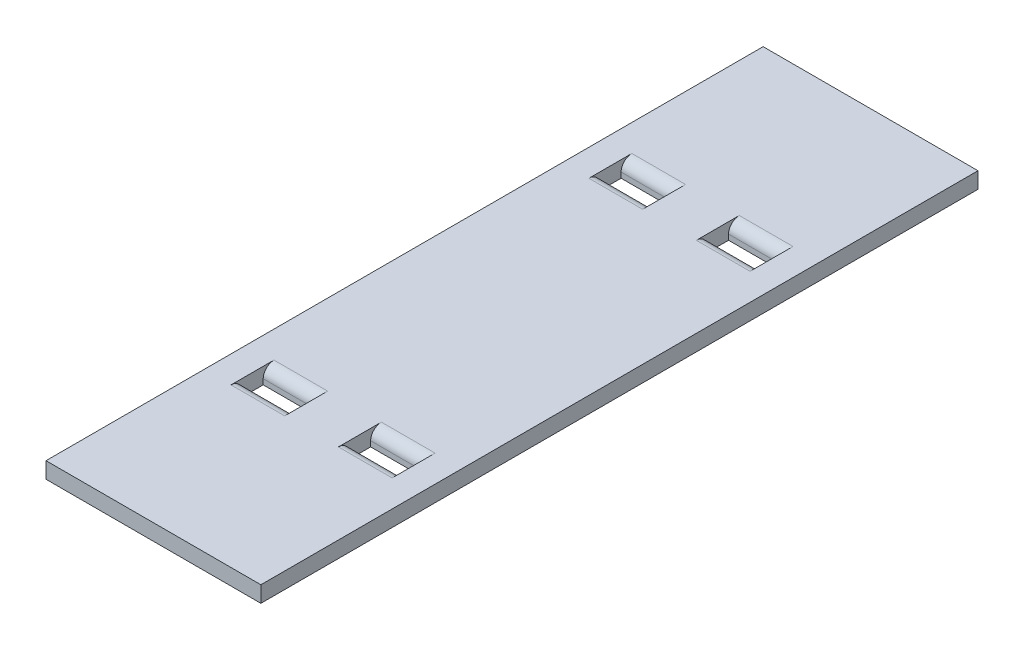
ISO-10303-21;
HEADER;
FILE_DESCRIPTION(('STEP AP214'),'2;1');
FILE_NAME('part.step','',(''),(''),'','','');
FILE_SCHEMA(('AUTOMOTIVE_DESIGN { 1 0 10303 214 1 1 1 1 }'));
ENDSEC;
DATA;
#1=APPLICATION_CONTEXT('core data for automotive mechanical design processes');
#2=APPLICATION_PROTOCOL_DEFINITION('international standard','automotive_design',2000,#1);
#3=PRODUCT_CONTEXT('',#1,'mechanical');
#4=PRODUCT('Part','Part','',(#3));
#5=PRODUCT_RELATED_PRODUCT_CATEGORY('part','',(#4));
#6=PRODUCT_DEFINITION_FORMATION('','',#4);
#7=PRODUCT_DEFINITION_CONTEXT('part definition',#1,'design');
#8=PRODUCT_DEFINITION('design','',#6,#7);
#9=PRODUCT_DEFINITION_SHAPE('','',#8);
#10=(LENGTH_UNIT() NAMED_UNIT(*) SI_UNIT(.MILLI.,.METRE.));
#11=(NAMED_UNIT(*) PLANE_ANGLE_UNIT() SI_UNIT($,.RADIAN.));
#12=(NAMED_UNIT(*) SI_UNIT($,.STERADIAN.) SOLID_ANGLE_UNIT());
#13=UNCERTAINTY_MEASURE_WITH_UNIT(LENGTH_MEASURE(1.E-05),#10,'distance_accuracy_value','');
#14=(GEOMETRIC_REPRESENTATION_CONTEXT(3) GLOBAL_UNCERTAINTY_ASSIGNED_CONTEXT((#13)) GLOBAL_UNIT_ASSIGNED_CONTEXT((#10,
#11,#12)) REPRESENTATION_CONTEXT('',''));
#15=CARTESIAN_POINT('',(0.,0.,0.));
#16=DIRECTION('',(0.,0.,1.));
#17=DIRECTION('',(1.,0.,0.));
#18=AXIS2_PLACEMENT_3D('',#15,#16,#17);
#19=CARTESIAN_POINT('',(20.,3.,-66.75));
#20=DIRECTION('',(-1.,0.,0.));
#21=DIRECTION('',(0.,0.,1.));
#22=AXIS2_PLACEMENT_3D('',#19,#20,#21);
#23=PLANE('',#22);
#24=DIRECTION('',(0.,0.,-1.));
#25=VECTOR('',#24,1.);
#26=CARTESIAN_POINT('',(20.,0.,-66.75));
#27=LINE('',#26,#25);
#28=CARTESIAN_POINT('',(20.,0.,66.75));
#29=VERTEX_POINT('',#28);
#30=CARTESIAN_POINT('',(20.,0.,-66.75));
#31=VERTEX_POINT('',#30);
#32=EDGE_CURVE('E376',#29,#31,#27,.T.);
#33=ORIENTED_EDGE('',*,*,#32,.T.);
#34=DIRECTION('',(0.,-1.,0.));
#35=VECTOR('',#34,1.);
#36=CARTESIAN_POINT('',(20.,3.,-66.75));
#37=LINE('',#36,#35);
#38=CARTESIAN_POINT('',(20.,3.,-66.75));
#39=VERTEX_POINT('',#38);
#40=EDGE_CURVE('E414',#39,#31,#37,.T.);
#41=ORIENTED_EDGE('',*,*,#40,.F.);
#42=DIRECTION('',(0.,0.,-1.));
#43=VECTOR('',#42,1.);
#44=CARTESIAN_POINT('',(20.,3.,-66.75));
#45=LINE('',#44,#43);
#46=CARTESIAN_POINT('',(20.,3.,66.75));
#47=VERTEX_POINT('',#46);
#48=EDGE_CURVE('E377',#47,#39,#45,.T.);
#49=ORIENTED_EDGE('',*,*,#48,.F.);
#50=DIRECTION('',(0.,-1.,0.));
#51=VECTOR('',#50,1.);
#52=CARTESIAN_POINT('',(20.,3.,66.75));
#53=LINE('',#52,#51);
#54=EDGE_CURVE('E391',#47,#29,#53,.T.);
#55=ORIENTED_EDGE('',*,*,#54,.T.);
#56=EDGE_LOOP('',(#33,#41,#49,#55));
#57=FACE_BOUND('',#56,.T.);
#58=ADVANCED_FACE('F45',(#57),#23,.F.);
#59=CARTESIAN_POINT('',(-20.,3.,-66.75));
#60=DIRECTION('',(0.,0.,1.));
#61=DIRECTION('',(1.,0.,0.));
#62=AXIS2_PLACEMENT_3D('',#59,#60,#61);
#63=PLANE('',#62);
#64=DIRECTION('',(-1.,0.,0.));
#65=VECTOR('',#64,1.);
#66=CARTESIAN_POINT('',(-20.,0.,-66.75));
#67=LINE('',#66,#65);
#68=CARTESIAN_POINT('',(-20.,0.,-66.75));
#69=VERTEX_POINT('',#68);
#70=EDGE_CURVE('E395',#31,#69,#67,.T.);
#71=ORIENTED_EDGE('',*,*,#70,.T.);
#72=DIRECTION('',(0.,-1.,0.));
#73=VECTOR('',#72,1.);
#74=CARTESIAN_POINT('',(-20.,3.,-66.75));
#75=LINE('',#74,#73);
#76=CARTESIAN_POINT('',(-20.,3.,-66.75));
#77=VERTEX_POINT('',#76);
#78=EDGE_CURVE('E410',#77,#69,#75,.T.);
#79=ORIENTED_EDGE('',*,*,#78,.F.);
#80=DIRECTION('',(-1.,0.,0.));
#81=VECTOR('',#80,1.);
#82=CARTESIAN_POINT('',(-20.,3.,-66.75));
#83=LINE('',#82,#81);
#84=EDGE_CURVE('E381',#39,#77,#83,.T.);
#85=ORIENTED_EDGE('',*,*,#84,.F.);
#86=ORIENTED_EDGE('',*,*,#40,.T.);
#87=EDGE_LOOP('',(#71,#79,#85,#86));
#88=FACE_BOUND('',#87,.T.);
#89=ADVANCED_FACE('F611',(#88),#63,.F.);
#90=CARTESIAN_POINT('',(-20.,3.,-66.75));
#91=DIRECTION('',(1.,0.,0.));
#92=DIRECTION('',(0.,0.,-1.));
#93=AXIS2_PLACEMENT_3D('',#90,#91,#92);
#94=PLANE('',#93);
#95=DIRECTION('',(0.,0.,1.));
#96=VECTOR('',#95,1.);
#97=CARTESIAN_POINT('',(-20.,0.,-66.75));
#98=LINE('',#97,#96);
#99=CARTESIAN_POINT('',(-20.,0.,66.75));
#100=VERTEX_POINT('',#99);
#101=EDGE_CURVE('E398',#69,#100,#98,.T.);
#102=ORIENTED_EDGE('',*,*,#101,.T.);
#103=DIRECTION('',(0.,-1.,0.));
#104=VECTOR('',#103,1.);
#105=CARTESIAN_POINT('',(-20.,3.,66.75));
#106=LINE('',#105,#104);
#107=CARTESIAN_POINT('',(-20.,3.,66.75));
#108=VERTEX_POINT('',#107);
#109=EDGE_CURVE('E406',#108,#100,#106,.T.);
#110=ORIENTED_EDGE('',*,*,#109,.F.);
#111=DIRECTION('',(0.,0.,1.));
#112=VECTOR('',#111,1.);
#113=CARTESIAN_POINT('',(-20.,3.,-66.75));
#114=LINE('',#113,#112);
#115=EDGE_CURVE('E385',#77,#108,#114,.T.);
#116=ORIENTED_EDGE('',*,*,#115,.F.);
#117=ORIENTED_EDGE('',*,*,#78,.T.);
#118=EDGE_LOOP('',(#102,#110,#116,#117));
#119=FACE_BOUND('',#118,.T.);
#120=ADVANCED_FACE('F617',(#119),#94,.F.);
#121=CARTESIAN_POINT('',(-20.,3.,66.75));
#122=DIRECTION('',(0.,0.,-1.));
#123=DIRECTION('',(-1.,0.,0.));
#124=AXIS2_PLACEMENT_3D('',#121,#122,#123);
#125=PLANE('',#124);
#126=DIRECTION('',(1.,0.,0.));
#127=VECTOR('',#126,1.);
#128=CARTESIAN_POINT('',(-20.,0.,66.75));
#129=LINE('',#128,#127);
#130=EDGE_CURVE('E382',#100,#29,#129,.T.);
#131=ORIENTED_EDGE('',*,*,#130,.T.);
#132=ORIENTED_EDGE('',*,*,#54,.F.);
#133=DIRECTION('',(1.,0.,0.));
#134=VECTOR('',#133,1.);
#135=CARTESIAN_POINT('',(-20.,3.,66.75));
#136=LINE('',#135,#134);
#137=EDGE_CURVE('E388',#108,#47,#136,.T.);
#138=ORIENTED_EDGE('',*,*,#137,.F.);
#139=ORIENTED_EDGE('',*,*,#109,.T.);
#140=EDGE_LOOP('',(#131,#132,#138,#139));
#141=FACE_BOUND('',#140,.T.);
#142=ADVANCED_FACE('F965',(#141),#125,.F.);
#143=CARTESIAN_POINT('',(0.,3.,0.));
#144=DIRECTION('',(0.,1.,0.));
#145=DIRECTION('',(0.,0.,1.));
#146=AXIS2_PLACEMENT_3D('',#143,#144,#145);
#147=PLANE('',#146);
#148=DIRECTION('',(0.,0.,-1.));
#149=VECTOR('',#148,1.);
#150=CARTESIAN_POINT('',(15.,3.,35.3125));
#151=LINE('',#150,#149);
#152=CARTESIAN_POINT('',(15.,3.,37.3125));
#153=VERTEX_POINT('',#152);
#154=CARTESIAN_POINT('',(15.,3.,29.3125));
#155=VERTEX_POINT('',#154);
#156=EDGE_CURVE('E314',#153,#155,#151,.T.);
#157=ORIENTED_EDGE('',*,*,#156,.F.);
#158=DIRECTION('',(1.,0.,0.));
#159=VECTOR('',#158,1.);
#160=CARTESIAN_POINT('',(5.,3.,37.3125));
#161=LINE('',#160,#159);
#162=CARTESIAN_POINT('',(5.,3.,37.3125));
#163=VERTEX_POINT('',#162);
#164=EDGE_CURVE('E490',#153,#163,#161,.F.);
#165=ORIENTED_EDGE('',*,*,#164,.T.);
#166=DIRECTION('',(0.,0.,1.));
#167=VECTOR('',#166,1.);
#168=CARTESIAN_POINT('',(5.,3.,35.3125));
#169=LINE('',#168,#167);
#170=CARTESIAN_POINT('',(5.,3.,29.3125));
#171=VERTEX_POINT('',#170);
#172=EDGE_CURVE('E328',#171,#163,#169,.T.);
#173=ORIENTED_EDGE('',*,*,#172,.F.);
#174=DIRECTION('',(-1.,0.,0.));
#175=VECTOR('',#174,1.);
#176=CARTESIAN_POINT('',(15.,3.,29.3125));
#177=LINE('',#176,#175);
#178=EDGE_CURVE('E486',#171,#155,#177,.F.);
#179=ORIENTED_EDGE('',*,*,#178,.T.);
#180=EDGE_LOOP('',(#157,#165,#173,#179));
#181=FACE_BOUND('',#180,.T.);
#182=DIRECTION('',(0.,0.,-1.));
#183=VECTOR('',#182,1.);
#184=CARTESIAN_POINT('',(-5.,3.,35.3125));
#185=LINE('',#184,#183);
#186=CARTESIAN_POINT('',(-5.,3.,37.3125));
#187=VERTEX_POINT('',#186);
#188=CARTESIAN_POINT('',(-5.,3.,29.3125));
#189=VERTEX_POINT('',#188);
#190=EDGE_CURVE('E291',#187,#189,#185,.T.);
#191=ORIENTED_EDGE('',*,*,#190,.F.);
#192=DIRECTION('',(1.,0.,0.));
#193=VECTOR('',#192,1.);
#194=CARTESIAN_POINT('',(-15.,3.,37.3125));
#195=LINE('',#194,#193);
#196=CARTESIAN_POINT('',(-15.,3.,37.3125));
#197=VERTEX_POINT('',#196);
#198=EDGE_CURVE('E498',#187,#197,#195,.F.);
#199=ORIENTED_EDGE('',*,*,#198,.T.);
#200=DIRECTION('',(0.,0.,1.));
#201=VECTOR('',#200,1.);
#202=CARTESIAN_POINT('',(-15.,3.,35.3125));
#203=LINE('',#202,#201);
#204=CARTESIAN_POINT('',(-15.,3.,29.3125));
#205=VERTEX_POINT('',#204);
#206=EDGE_CURVE('E277',#205,#197,#203,.T.);
#207=ORIENTED_EDGE('',*,*,#206,.F.);
#208=DIRECTION('',(-1.,0.,0.));
#209=VECTOR('',#208,1.);
#210=CARTESIAN_POINT('',(-5.,3.,29.3125));
#211=LINE('',#210,#209);
#212=EDGE_CURVE('E494',#205,#189,#211,.F.);
#213=ORIENTED_EDGE('',*,*,#212,.T.);
#214=EDGE_LOOP('',(#191,#199,#207,#213));
#215=FACE_BOUND('',#214,.T.);
#216=DIRECTION('',(0.,0.,-1.));
#217=VECTOR('',#216,1.);
#218=CARTESIAN_POINT('',(-5.,3.,-35.3125));
#219=LINE('',#218,#217);
#220=CARTESIAN_POINT('',(-5.,3.,-29.3125));
#221=VERTEX_POINT('',#220);
#222=CARTESIAN_POINT('',(-5.,3.,-37.3125));
#223=VERTEX_POINT('',#222);
#224=EDGE_CURVE('E255',#221,#223,#219,.T.);
#225=ORIENTED_EDGE('',*,*,#224,.F.);
#226=DIRECTION('',(1.,0.,0.));
#227=VECTOR('',#226,1.);
#228=CARTESIAN_POINT('',(-15.,3.,-29.3125));
#229=LINE('',#228,#227);
#230=CARTESIAN_POINT('',(-15.,3.,-29.3125));
#231=VERTEX_POINT('',#230);
#232=EDGE_CURVE('E482',#221,#231,#229,.F.);
#233=ORIENTED_EDGE('',*,*,#232,.T.);
#234=DIRECTION('',(0.,0.,1.));
#235=VECTOR('',#234,1.);
#236=CARTESIAN_POINT('',(-15.,3.,-35.3125));
#237=LINE('',#236,#235);
#238=CARTESIAN_POINT('',(-15.,3.,-37.3125));
#239=VERTEX_POINT('',#238);
#240=EDGE_CURVE('E1013',#239,#231,#237,.T.);
#241=ORIENTED_EDGE('',*,*,#240,.F.);
#242=DIRECTION('',(-1.,0.,0.));
#243=VECTOR('',#242,1.);
#244=CARTESIAN_POINT('',(-5.,3.,-37.3125));
#245=LINE('',#244,#243);
#246=EDGE_CURVE('E478',#239,#223,#245,.F.);
#247=ORIENTED_EDGE('',*,*,#246,.T.);
#248=EDGE_LOOP('',(#225,#233,#241,#247));
#249=FACE_BOUND('',#248,.T.);
#250=DIRECTION('',(0.,0.,-1.));
#251=VECTOR('',#250,1.);
#252=CARTESIAN_POINT('',(15.,3.,-35.3125));
#253=LINE('',#252,#251);
#254=CARTESIAN_POINT('',(15.,3.,-29.3125));
#255=VERTEX_POINT('',#254);
#256=CARTESIAN_POINT('',(15.,3.,-37.3125));
#257=VERTEX_POINT('',#256);
#258=EDGE_CURVE('E351',#255,#257,#253,.T.);
#259=ORIENTED_EDGE('',*,*,#258,.F.);
#260=DIRECTION('',(1.,0.,0.));
#261=VECTOR('',#260,1.);
#262=CARTESIAN_POINT('',(5.,3.,-29.3125));
#263=LINE('',#262,#261);
#264=CARTESIAN_POINT('',(5.,3.,-29.3125));
#265=VERTEX_POINT('',#264);
#266=EDGE_CURVE('E474',#255,#265,#263,.F.);
#267=ORIENTED_EDGE('',*,*,#266,.T.);
#268=DIRECTION('',(0.,0.,1.));
#269=VECTOR('',#268,1.);
#270=CARTESIAN_POINT('',(5.,3.,-35.3125));
#271=LINE('',#270,#269);
#272=CARTESIAN_POINT('',(5.,3.,-37.3125));
#273=VERTEX_POINT('',#272);
#274=EDGE_CURVE('E354',#273,#265,#271,.T.);
#275=ORIENTED_EDGE('',*,*,#274,.F.);
#276=DIRECTION('',(-1.,0.,0.));
#277=VECTOR('',#276,1.);
#278=CARTESIAN_POINT('',(15.,3.,-37.3125));
#279=LINE('',#278,#277);
#280=EDGE_CURVE('E470',#273,#257,#279,.F.);
#281=ORIENTED_EDGE('',*,*,#280,.T.);
#282=EDGE_LOOP('',(#259,#267,#275,#281));
#283=FACE_BOUND('',#282,.T.);
#284=ORIENTED_EDGE('',*,*,#48,.T.);
#285=ORIENTED_EDGE('',*,*,#84,.T.);
#286=ORIENTED_EDGE('',*,*,#115,.T.);
#287=ORIENTED_EDGE('',*,*,#137,.T.);
#288=EDGE_LOOP('',(#284,#285,#286,#287));
#289=FACE_BOUND('',#288,.T.);
#290=ADVANCED_FACE('F579',(#181,#215,#249,#283,#289),#147,.T.);
#291=CARTESIAN_POINT('',(0.,0.,0.));
#292=DIRECTION('',(0.,1.,0.));
#293=DIRECTION('',(0.,0.,1.));
#294=AXIS2_PLACEMENT_3D('',#291,#292,#293);
#295=PLANE('',#294);
#296=DIRECTION('',(1.,0.,0.));
#297=VECTOR('',#296,1.);
#298=CARTESIAN_POINT('',(5.,0.,31.3125));
#299=LINE('',#298,#297);
#300=CARTESIAN_POINT('',(5.,0.,31.3125));
#301=VERTEX_POINT('',#300);
#302=CARTESIAN_POINT('',(15.,0.,31.3125));
#303=VERTEX_POINT('',#302);
#304=EDGE_CURVE('E335',#301,#303,#299,.T.);
#305=ORIENTED_EDGE('',*,*,#304,.F.);
#306=DIRECTION('',(0.,0.,-1.));
#307=VECTOR('',#306,1.);
#308=CARTESIAN_POINT('',(5.,0.,35.3125));
#309=LINE('',#308,#307);
#310=CARTESIAN_POINT('',(5.,0.,35.3125));
#311=VERTEX_POINT('',#310);
#312=EDGE_CURVE('E331',#311,#301,#309,.T.);
#313=ORIENTED_EDGE('',*,*,#312,.F.);
#314=DIRECTION('',(-1.,0.,0.));
#315=VECTOR('',#314,1.);
#316=CARTESIAN_POINT('',(5.,0.,35.3125));
#317=LINE('',#316,#315);
#318=CARTESIAN_POINT('',(15.,0.,35.3125));
#319=VERTEX_POINT('',#318);
#320=EDGE_CURVE('E305',#319,#311,#317,.T.);
#321=ORIENTED_EDGE('',*,*,#320,.F.);
#322=DIRECTION('',(0.,0.,1.));
#323=VECTOR('',#322,1.);
#324=CARTESIAN_POINT('',(15.,0.,35.3125));
#325=LINE('',#324,#323);
#326=EDGE_CURVE('E272',#303,#319,#325,.T.);
#327=ORIENTED_EDGE('',*,*,#326,.F.);
#328=EDGE_LOOP('',(#305,#313,#321,#327));
#329=FACE_BOUND('',#328,.T.);
#330=DIRECTION('',(0.,0.,-1.));
#331=VECTOR('',#330,1.);
#332=CARTESIAN_POINT('',(-15.,0.,35.3125));
#333=LINE('',#332,#331);
#334=CARTESIAN_POINT('',(-15.,0.,35.3125));
#335=VERTEX_POINT('',#334);
#336=CARTESIAN_POINT('',(-15.,0.,31.3125));
#337=VERTEX_POINT('',#336);
#338=EDGE_CURVE('E298',#335,#337,#333,.T.);
#339=ORIENTED_EDGE('',*,*,#338,.F.);
#340=DIRECTION('',(-1.,0.,0.));
#341=VECTOR('',#340,1.);
#342=CARTESIAN_POINT('',(-5.,0.,35.3125));
#343=LINE('',#342,#341);
#344=CARTESIAN_POINT('',(-5.,0.,35.3125));
#345=VERTEX_POINT('',#344);
#346=EDGE_CURVE('E294',#345,#335,#343,.T.);
#347=ORIENTED_EDGE('',*,*,#346,.F.);
#348=DIRECTION('',(0.,0.,1.));
#349=VECTOR('',#348,1.);
#350=CARTESIAN_POINT('',(-5.,0.,35.3125));
#351=LINE('',#350,#349);
#352=CARTESIAN_POINT('',(-5.,0.,31.3125));
#353=VERTEX_POINT('',#352);
#354=EDGE_CURVE('E267',#353,#345,#351,.T.);
#355=ORIENTED_EDGE('',*,*,#354,.F.);
#356=DIRECTION('',(1.,0.,0.));
#357=VECTOR('',#356,1.);
#358=CARTESIAN_POINT('',(-5.,0.,31.3125));
#359=LINE('',#358,#357);
#360=EDGE_CURVE('E302',#337,#353,#359,.T.);
#361=ORIENTED_EDGE('',*,*,#360,.F.);
#362=EDGE_LOOP('',(#339,#347,#355,#361));
#363=FACE_BOUND('',#362,.T.);
#364=DIRECTION('',(-1.,0.,0.));
#365=VECTOR('',#364,1.);
#366=CARTESIAN_POINT('',(-5.,0.,-31.3125));
#367=LINE('',#366,#365);
#368=CARTESIAN_POINT('',(-5.,0.,-31.3125));
#369=VERTEX_POINT('',#368);
#370=CARTESIAN_POINT('',(-15.,0.,-31.3125));
#371=VERTEX_POINT('',#370);
#372=EDGE_CURVE('E236',#369,#371,#367,.T.);
#373=ORIENTED_EDGE('',*,*,#372,.F.);
#374=DIRECTION('',(0.,0.,1.));
#375=VECTOR('',#374,1.);
#376=CARTESIAN_POINT('',(-5.,0.,-35.3125));
#377=LINE('',#376,#375);
#378=CARTESIAN_POINT('',(-5.,0.,-35.3125));
#379=VERTEX_POINT('',#378);
#380=EDGE_CURVE('E247',#379,#369,#377,.T.);
#381=ORIENTED_EDGE('',*,*,#380,.F.);
#382=DIRECTION('',(1.,0.,0.));
#383=VECTOR('',#382,1.);
#384=CARTESIAN_POINT('',(-5.,0.,-35.3125));
#385=LINE('',#384,#383);
#386=CARTESIAN_POINT('',(-15.,0.,-35.3125));
#387=VERTEX_POINT('',#386);
#388=EDGE_CURVE('E244',#387,#379,#385,.T.);
#389=ORIENTED_EDGE('',*,*,#388,.F.);
#390=DIRECTION('',(0.,0.,-1.));
#391=VECTOR('',#390,1.);
#392=CARTESIAN_POINT('',(-15.,0.,-35.3125));
#393=LINE('',#392,#391);
#394=EDGE_CURVE('E259',#371,#387,#393,.T.);
#395=ORIENTED_EDGE('',*,*,#394,.F.);
#396=EDGE_LOOP('',(#373,#381,#389,#395));
#397=FACE_BOUND('',#396,.T.);
#398=DIRECTION('',(-1.,0.,0.));
#399=VECTOR('',#398,1.);
#400=CARTESIAN_POINT('',(5.,0.,-31.3125));
#401=LINE('',#400,#399);
#402=CARTESIAN_POINT('',(15.,0.,-31.3125));
#403=VERTEX_POINT('',#402);
#404=CARTESIAN_POINT('',(5.,0.,-31.3125));
#405=VERTEX_POINT('',#404);
#406=EDGE_CURVE('E343',#403,#405,#401,.T.);
#407=ORIENTED_EDGE('',*,*,#406,.F.);
#408=DIRECTION('',(0.,0.,1.));
#409=VECTOR('',#408,1.);
#410=CARTESIAN_POINT('',(15.,0.,-35.3125));
#411=LINE('',#410,#409);
#412=CARTESIAN_POINT('',(15.,0.,-35.3125));
#413=VERTEX_POINT('',#412);
#414=EDGE_CURVE('E347',#413,#403,#411,.T.);
#415=ORIENTED_EDGE('',*,*,#414,.F.);
#416=DIRECTION('',(1.,0.,0.));
#417=VECTOR('',#416,1.);
#418=CARTESIAN_POINT('',(5.,0.,-35.3125));
#419=LINE('',#418,#417);
#420=CARTESIAN_POINT('',(5.,0.,-35.3125));
#421=VERTEX_POINT('',#420);
#422=EDGE_CURVE('E362',#421,#413,#419,.T.);
#423=ORIENTED_EDGE('',*,*,#422,.F.);
#424=DIRECTION('',(0.,0.,-1.));
#425=VECTOR('',#424,1.);
#426=CARTESIAN_POINT('',(5.,0.,-35.3125));
#427=LINE('',#426,#425);
#428=EDGE_CURVE('E263',#405,#421,#427,.T.);
#429=ORIENTED_EDGE('',*,*,#428,.F.);
#430=EDGE_LOOP('',(#407,#415,#423,#429));
#431=FACE_BOUND('',#430,.T.);
#432=CARTESIAN_POINT('',(10.,0.,-56.75));
#433=DIRECTION('',(0.,1.,0.));
#434=DIRECTION('',(0.,0.,1.));
#435=AXIS2_PLACEMENT_3D('',#432,#433,#434);
#436=CIRCLE('',#435,6.11);
#437=CARTESIAN_POINT('',(10.,0.,-50.64));
#438=VERTEX_POINT('',#437);
#439=EDGE_CURVE('E430',#438,#438,#436,.F.);
#440=ORIENTED_EDGE('',*,*,#439,.F.);
#441=EDGE_LOOP('',(#440));
#442=FACE_BOUND('',#441,.T.);
#443=CARTESIAN_POINT('',(-10.,0.,-56.75));
#444=DIRECTION('',(0.,1.,0.));
#445=DIRECTION('',(0.,0.,1.));
#446=AXIS2_PLACEMENT_3D('',#443,#444,#445);
#447=CIRCLE('',#446,6.11);
#448=CARTESIAN_POINT('',(-10.,0.,-50.64));
#449=VERTEX_POINT('',#448);
#450=EDGE_CURVE('E426',#449,#449,#447,.F.);
#451=ORIENTED_EDGE('',*,*,#450,.F.);
#452=EDGE_LOOP('',(#451));
#453=FACE_BOUND('',#452,.T.);
#454=CARTESIAN_POINT('',(-10.,0.,56.75));
#455=DIRECTION('',(0.,1.,0.));
#456=DIRECTION('',(0.,0.,1.));
#457=AXIS2_PLACEMENT_3D('',#454,#455,#456);
#458=CIRCLE('',#457,6.11);
#459=CARTESIAN_POINT('',(-10.,0.,62.86));
#460=VERTEX_POINT('',#459);
#461=EDGE_CURVE('E422',#460,#460,#458,.F.);
#462=ORIENTED_EDGE('',*,*,#461,.F.);
#463=EDGE_LOOP('',(#462));
#464=FACE_BOUND('',#463,.T.);
#465=CARTESIAN_POINT('',(10.,0.,56.75));
#466=DIRECTION('',(0.,1.,0.));
#467=DIRECTION('',(0.,0.,1.));
#468=AXIS2_PLACEMENT_3D('',#465,#466,#467);
#469=CIRCLE('',#468,6.11);
#470=CARTESIAN_POINT('',(10.,0.,62.86));
#471=VERTEX_POINT('',#470);
#472=EDGE_CURVE('E418',#471,#471,#469,.F.);
#473=ORIENTED_EDGE('',*,*,#472,.F.);
#474=EDGE_LOOP('',(#473));
#475=FACE_BOUND('',#474,.T.);
#476=ORIENTED_EDGE('',*,*,#32,.F.);
#477=ORIENTED_EDGE('',*,*,#130,.F.);
#478=ORIENTED_EDGE('',*,*,#101,.F.);
#479=ORIENTED_EDGE('',*,*,#70,.F.);
#480=EDGE_LOOP('',(#476,#477,#478,#479));
#481=FACE_BOUND('',#480,.T.);
#482=ADVANCED_FACE('F257',(#329,#363,#397,#431,#442,#453,#464,#475,#481),#295,.F.);
#483=CARTESIAN_POINT('',(10.,-3.,56.75));
#484=DIRECTION('',(0.,1.,0.));
#485=DIRECTION('',(0.,0.,1.));
#486=AXIS2_PLACEMENT_3D('',#483,#484,#485);
#487=CYLINDRICAL_SURFACE('',#486,6.11);
#488=CARTESIAN_POINT('',(10.,-2.,56.75));
#489=DIRECTION('',(0.,-1.,0.));
#490=DIRECTION('',(0.,0.,-1.));
#491=AXIS2_PLACEMENT_3D('',#488,#489,#490);
#492=CIRCLE('',#491,6.11);
#493=CARTESIAN_POINT('',(10.,-2.,50.64));
#494=VERTEX_POINT('',#493);
#495=EDGE_CURVE('E446',#494,#494,#492,.F.);
#496=ORIENTED_EDGE('',*,*,#495,.T.);
#497=EDGE_LOOP('',(#496));
#498=FACE_BOUND('',#497,.T.);
#499=ORIENTED_EDGE('',*,*,#472,.T.);
#500=EDGE_LOOP('',(#499));
#501=FACE_BOUND('',#500,.T.);
#502=ADVANCED_FACE('F937',(#498,#501),#487,.T.);
#503=CARTESIAN_POINT('',(10.,-3.,56.75));
#504=DIRECTION('',(0.,-1.,0.));
#505=DIRECTION('',(0.,0.,-1.));
#506=AXIS2_PLACEMENT_3D('',#503,#504,#505);
#507=PLANE('',#506);
#508=CARTESIAN_POINT('',(10.,-3.,56.75));
#509=DIRECTION('',(0.,-1.,0.));
#510=DIRECTION('',(0.,0.,-1.));
#511=AXIS2_PLACEMENT_3D('',#508,#509,#510);
#512=CIRCLE('',#511,5.11);
#513=CARTESIAN_POINT('',(10.,-3.,51.64));
#514=VERTEX_POINT('',#513);
#515=EDGE_CURVE('E442',#514,#514,#512,.T.);
#516=ORIENTED_EDGE('',*,*,#515,.T.);
#517=EDGE_LOOP('',(#516));
#518=FACE_BOUND('',#517,.T.);
#519=ADVANCED_FACE('F928',(#518),#507,.T.);
#520=CARTESIAN_POINT('',(-10.,-3.,56.75));
#521=DIRECTION('',(0.,1.,0.));
#522=DIRECTION('',(0.,0.,1.));
#523=AXIS2_PLACEMENT_3D('',#520,#521,#522);
#524=CYLINDRICAL_SURFACE('',#523,6.11);
#525=CARTESIAN_POINT('',(-10.,-2.,56.75));
#526=DIRECTION('',(0.,1.,0.));
#527=DIRECTION('',(0.,0.,1.));
#528=AXIS2_PLACEMENT_3D('',#525,#526,#527);
#529=CIRCLE('',#528,6.11);
#530=CARTESIAN_POINT('',(-10.,-2.,62.86));
#531=VERTEX_POINT('',#530);
#532=EDGE_CURVE('E438',#531,#531,#529,.T.);
#533=ORIENTED_EDGE('',*,*,#532,.T.);
#534=EDGE_LOOP('',(#533));
#535=FACE_BOUND('',#534,.T.);
#536=ORIENTED_EDGE('',*,*,#461,.T.);
#537=EDGE_LOOP('',(#536));
#538=FACE_BOUND('',#537,.T.);
#539=ADVANCED_FACE('F918',(#535,#538),#524,.T.);
#540=CARTESIAN_POINT('',(-10.,-3.,56.75));
#541=DIRECTION('',(0.,1.,0.));
#542=DIRECTION('',(0.,0.,1.));
#543=AXIS2_PLACEMENT_3D('',#540,#541,#542);
#544=PLANE('',#543);
#545=CARTESIAN_POINT('',(-10.,-3.,56.75));
#546=DIRECTION('',(0.,1.,0.));
#547=DIRECTION('',(0.,0.,1.));
#548=AXIS2_PLACEMENT_3D('',#545,#546,#547);
#549=CIRCLE('',#548,5.11);
#550=CARTESIAN_POINT('',(-10.,-3.,61.86));
#551=VERTEX_POINT('',#550);
#552=EDGE_CURVE('E434',#551,#551,#549,.F.);
#553=ORIENTED_EDGE('',*,*,#552,.T.);
#554=EDGE_LOOP('',(#553));
#555=FACE_BOUND('',#554,.T.);
#556=ADVANCED_FACE('F908',(#555),#544,.F.);
#557=CARTESIAN_POINT('',(-10.,-3.,-56.75));
#558=DIRECTION('',(0.,1.,0.));
#559=DIRECTION('',(0.,0.,1.));
#560=AXIS2_PLACEMENT_3D('',#557,#558,#559);
#561=CYLINDRICAL_SURFACE('',#560,6.11);
#562=CARTESIAN_POINT('',(-10.,-2.,-56.75));
#563=DIRECTION('',(0.,-1.,0.));
#564=DIRECTION('',(0.,0.,-1.));
#565=AXIS2_PLACEMENT_3D('',#562,#563,#564);
#566=CIRCLE('',#565,6.11);
#567=CARTESIAN_POINT('',(-10.,-2.,-62.86));
#568=VERTEX_POINT('',#567);
#569=EDGE_CURVE('E454',#568,#568,#566,.F.);
#570=ORIENTED_EDGE('',*,*,#569,.T.);
#571=EDGE_LOOP('',(#570));
#572=FACE_BOUND('',#571,.T.);
#573=ORIENTED_EDGE('',*,*,#450,.T.);
#574=EDGE_LOOP('',(#573));
#575=FACE_BOUND('',#574,.T.);
#576=ADVANCED_FACE('F898',(#572,#575),#561,.T.);
#577=CARTESIAN_POINT('',(-10.,-3.,-56.75));
#578=DIRECTION('',(0.,-1.,0.));
#579=DIRECTION('',(0.,0.,-1.));
#580=AXIS2_PLACEMENT_3D('',#577,#578,#579);
#581=PLANE('',#580);
#582=CARTESIAN_POINT('',(-10.,-3.,-56.75));
#583=DIRECTION('',(0.,-1.,0.));
#584=DIRECTION('',(0.,0.,-1.));
#585=AXIS2_PLACEMENT_3D('',#582,#583,#584);
#586=CIRCLE('',#585,5.11);
#587=CARTESIAN_POINT('',(-10.,-3.,-61.86));
#588=VERTEX_POINT('',#587);
#589=EDGE_CURVE('E450',#588,#588,#586,.T.);
#590=ORIENTED_EDGE('',*,*,#589,.T.);
#591=EDGE_LOOP('',(#590));
#592=FACE_BOUND('',#591,.T.);
#593=ADVANCED_FACE('F888',(#592),#581,.T.);
#594=CARTESIAN_POINT('',(10.,-3.,-56.75));
#595=DIRECTION('',(0.,1.,0.));
#596=DIRECTION('',(0.,0.,1.));
#597=AXIS2_PLACEMENT_3D('',#594,#595,#596);
#598=CYLINDRICAL_SURFACE('',#597,6.11);
#599=CARTESIAN_POINT('',(10.,-2.,-56.75));
#600=DIRECTION('',(0.,1.,0.));
#601=DIRECTION('',(0.,0.,1.));
#602=AXIS2_PLACEMENT_3D('',#599,#600,#601);
#603=CIRCLE('',#602,6.11);
#604=CARTESIAN_POINT('',(10.,-2.,-50.64));
#605=VERTEX_POINT('',#604);
#606=EDGE_CURVE('E462',#605,#605,#603,.T.);
#607=ORIENTED_EDGE('',*,*,#606,.T.);
#608=EDGE_LOOP('',(#607));
#609=FACE_BOUND('',#608,.T.);
#610=ORIENTED_EDGE('',*,*,#439,.T.);
#611=EDGE_LOOP('',(#610));
#612=FACE_BOUND('',#611,.T.);
#613=ADVANCED_FACE('F605',(#609,#612),#598,.T.);
#614=CARTESIAN_POINT('',(10.,-3.,-56.75));
#615=DIRECTION('',(0.,1.,0.));
#616=DIRECTION('',(0.,0.,1.));
#617=AXIS2_PLACEMENT_3D('',#614,#615,#616);
#618=PLANE('',#617);
#619=CARTESIAN_POINT('',(10.,-3.,-56.75));
#620=DIRECTION('',(0.,1.,0.));
#621=DIRECTION('',(0.,0.,1.));
#622=AXIS2_PLACEMENT_3D('',#619,#620,#621);
#623=CIRCLE('',#622,5.11);
#624=CARTESIAN_POINT('',(10.,-3.,-51.64));
#625=VERTEX_POINT('',#624);
#626=EDGE_CURVE('E458',#625,#625,#623,.F.);
#627=ORIENTED_EDGE('',*,*,#626,.T.);
#628=EDGE_LOOP('',(#627));
#629=FACE_BOUND('',#628,.T.);
#630=ADVANCED_FACE('F597',(#629),#618,.F.);
#631=CARTESIAN_POINT('',(15.,-3.001,-35.3125));
#632=DIRECTION('',(1.,0.,0.));
#633=DIRECTION('',(0.,0.,-1.));
#634=AXIS2_PLACEMENT_3D('',#631,#632,#633);
#635=PLANE('',#634);
#636=ORIENTED_EDGE('',*,*,#414,.T.);
#637=DIRECTION('',(0.,1.,0.));
#638=VECTOR('',#637,1.);
#639=CARTESIAN_POINT('',(15.,-3.001,-31.3125));
#640=LINE('',#639,#638);
#641=CARTESIAN_POINT('',(15.,0.999999999999998,-31.3125));
#642=VERTEX_POINT('',#641);
#643=EDGE_CURVE('E358',#403,#642,#640,.T.);
#644=ORIENTED_EDGE('',*,*,#643,.T.);
#645=CARTESIAN_POINT('',(15.,1.,-29.3125));
#646=DIRECTION('',(1.,0.,0.));
#647=DIRECTION('',(0.,0.,-1.));
#648=AXIS2_PLACEMENT_3D('',#645,#646,#647);
#649=CIRCLE('',#648,2.);
#650=EDGE_CURVE('E568',#642,#255,#649,.T.);
#651=ORIENTED_EDGE('',*,*,#650,.T.);
#652=ORIENTED_EDGE('',*,*,#258,.T.);
#653=CARTESIAN_POINT('',(15.,1.,-37.3125));
#654=DIRECTION('',(1.,0.,0.));
#655=DIRECTION('',(0.,0.,-1.));
#656=AXIS2_PLACEMENT_3D('',#653,#654,#655);
#657=CIRCLE('',#656,2.);
#658=CARTESIAN_POINT('',(15.,0.999999999999998,-35.3125));
#659=VERTEX_POINT('',#658);
#660=EDGE_CURVE('E11',#257,#659,#657,.T.);
#661=ORIENTED_EDGE('',*,*,#660,.T.);
#662=DIRECTION('',(0.,1.,0.));
#663=VECTOR('',#662,1.);
#664=CARTESIAN_POINT('',(15.,-3.001,-35.3125));
#665=LINE('',#664,#663);
#666=EDGE_CURVE('E357',#413,#659,#665,.T.);
#667=ORIENTED_EDGE('',*,*,#666,.F.);
#668=EDGE_LOOP('',(#636,#644,#651,#652,#661,#667));
#669=FACE_BOUND('',#668,.T.);
#670=ADVANCED_FACE('F595',(#669),#635,.F.);
#671=CARTESIAN_POINT('',(5.,-3.001,-31.3125));
#672=DIRECTION('',(0.,0.,1.));
#673=DIRECTION('',(1.,0.,0.));
#674=AXIS2_PLACEMENT_3D('',#671,#672,#673);
#675=PLANE('',#674);
#676=DIRECTION('',(0.,1.,0.));
#677=VECTOR('',#676,1.);
#678=CARTESIAN_POINT('',(5.,-3.001,-31.3125));
#679=LINE('',#678,#677);
#680=CARTESIAN_POINT('',(5.,0.999999999999998,-31.3125));
#681=VERTEX_POINT('',#680);
#682=EDGE_CURVE('E363',#405,#681,#679,.T.);
#683=ORIENTED_EDGE('',*,*,#682,.T.);
#684=DIRECTION('',(1.,0.,0.));
#685=VECTOR('',#684,1.);
#686=CARTESIAN_POINT('',(15.,1.,-31.3125));
#687=LINE('',#686,#685);
#688=EDGE_CURVE('E520',#681,#642,#687,.T.);
#689=ORIENTED_EDGE('',*,*,#688,.T.);
#690=ORIENTED_EDGE('',*,*,#643,.F.);
#691=ORIENTED_EDGE('',*,*,#406,.T.);
#692=EDGE_LOOP('',(#683,#689,#690,#691));
#693=FACE_BOUND('',#692,.T.);
#694=ADVANCED_FACE('F587',(#693),#675,.F.);
#695=CARTESIAN_POINT('',(5.,-3.001,-35.3125));
#696=DIRECTION('',(-1.,0.,0.));
#697=DIRECTION('',(0.,0.,1.));
#698=AXIS2_PLACEMENT_3D('',#695,#696,#697);
#699=PLANE('',#698);
#700=ORIENTED_EDGE('',*,*,#428,.T.);
#701=DIRECTION('',(0.,1.,0.));
#702=VECTOR('',#701,1.);
#703=CARTESIAN_POINT('',(5.,-3.001,-35.3125));
#704=LINE('',#703,#702);
#705=CARTESIAN_POINT('',(5.,0.999999999999998,-35.3125));
#706=VERTEX_POINT('',#705);
#707=EDGE_CURVE('E367',#421,#706,#704,.T.);
#708=ORIENTED_EDGE('',*,*,#707,.T.);
#709=CARTESIAN_POINT('',(5.,1.,-37.3125));
#710=DIRECTION('',(-1.,0.,0.));
#711=DIRECTION('',(0.,0.,1.));
#712=AXIS2_PLACEMENT_3D('',#709,#710,#711);
#713=CIRCLE('',#712,2.);
#714=EDGE_CURVE('E54',#706,#273,#713,.T.);
#715=ORIENTED_EDGE('',*,*,#714,.T.);
#716=ORIENTED_EDGE('',*,*,#274,.T.);
#717=CARTESIAN_POINT('',(5.,1.,-29.3125));
#718=DIRECTION('',(-1.,0.,0.));
#719=DIRECTION('',(0.,0.,1.));
#720=AXIS2_PLACEMENT_3D('',#717,#718,#719);
#721=CIRCLE('',#720,2.);
#722=EDGE_CURVE('E572',#265,#681,#721,.T.);
#723=ORIENTED_EDGE('',*,*,#722,.T.);
#724=ORIENTED_EDGE('',*,*,#682,.F.);
#725=EDGE_LOOP('',(#700,#708,#715,#716,#723,#724));
#726=FACE_BOUND('',#725,.T.);
#727=ADVANCED_FACE('F576',(#726),#699,.F.);
#728=CARTESIAN_POINT('',(5.,-3.001,-35.3125));
#729=DIRECTION('',(0.,0.,-1.));
#730=DIRECTION('',(-1.,0.,0.));
#731=AXIS2_PLACEMENT_3D('',#728,#729,#730);
#732=PLANE('',#731);
#733=ORIENTED_EDGE('',*,*,#666,.T.);
#734=DIRECTION('',(-1.,0.,0.));
#735=VECTOR('',#734,1.);
#736=CARTESIAN_POINT('',(5.,1.,-35.3125));
#737=LINE('',#736,#735);
#738=EDGE_CURVE('E524',#659,#706,#737,.T.);
#739=ORIENTED_EDGE('',*,*,#738,.T.);
#740=ORIENTED_EDGE('',*,*,#707,.F.);
#741=ORIENTED_EDGE('',*,*,#422,.T.);
#742=EDGE_LOOP('',(#733,#739,#740,#741));
#743=FACE_BOUND('',#742,.T.);
#744=ADVANCED_FACE('F594',(#743),#732,.F.);
#745=CARTESIAN_POINT('',(-5.,-3.001,-35.3125));
#746=DIRECTION('',(1.,0.,0.));
#747=DIRECTION('',(0.,0.,-1.));
#748=AXIS2_PLACEMENT_3D('',#745,#746,#747);
#749=PLANE('',#748);
#750=ORIENTED_EDGE('',*,*,#380,.T.);
#751=DIRECTION('',(0.,1.,0.));
#752=VECTOR('',#751,1.);
#753=CARTESIAN_POINT('',(-5.,-3.001,-31.3125));
#754=LINE('',#753,#752);
#755=CARTESIAN_POINT('',(-5.,0.999999999999998,-31.3125));
#756=VERTEX_POINT('',#755);
#757=EDGE_CURVE('E231',#369,#756,#754,.T.);
#758=ORIENTED_EDGE('',*,*,#757,.T.);
#759=CARTESIAN_POINT('',(-5.,1.,-29.3125));
#760=DIRECTION('',(1.,0.,0.));
#761=DIRECTION('',(0.,0.,-1.));
#762=AXIS2_PLACEMENT_3D('',#759,#760,#761);
#763=CIRCLE('',#762,2.);
#764=EDGE_CURVE('E555',#756,#221,#763,.T.);
#765=ORIENTED_EDGE('',*,*,#764,.T.);
#766=ORIENTED_EDGE('',*,*,#224,.T.);
#767=CARTESIAN_POINT('',(-5.,1.,-37.3125));
#768=DIRECTION('',(1.,0.,0.));
#769=DIRECTION('',(0.,0.,-1.));
#770=AXIS2_PLACEMENT_3D('',#767,#768,#769);
#771=CIRCLE('',#770,2.);
#772=CARTESIAN_POINT('',(-5.,0.999999999999998,-35.3125));
#773=VERTEX_POINT('',#772);
#774=EDGE_CURVE('E565',#223,#773,#771,.T.);
#775=ORIENTED_EDGE('',*,*,#774,.T.);
#776=DIRECTION('',(0.,1.,0.));
#777=VECTOR('',#776,1.);
#778=CARTESIAN_POINT('',(-5.,-3.001,-35.3125));
#779=LINE('',#778,#777);
#780=EDGE_CURVE('E250',#379,#773,#779,.T.);
#781=ORIENTED_EDGE('',*,*,#780,.F.);
#782=EDGE_LOOP('',(#750,#758,#765,#766,#775,#781));
#783=FACE_BOUND('',#782,.T.);
#784=ADVANCED_FACE('F248',(#783),#749,.F.);
#785=CARTESIAN_POINT('',(-5.,-3.001,-31.3125));
#786=DIRECTION('',(0.,0.,1.));
#787=DIRECTION('',(1.,0.,0.));
#788=AXIS2_PLACEMENT_3D('',#785,#786,#787);
#789=PLANE('',#788);
#790=DIRECTION('',(0.,1.,0.));
#791=VECTOR('',#790,1.);
#792=CARTESIAN_POINT('',(-15.,-3.001,-31.3125));
#793=LINE('',#792,#791);
#794=CARTESIAN_POINT('',(-15.,0.999999999999998,-31.3125));
#795=VERTEX_POINT('',#794);
#796=EDGE_CURVE('E243',#371,#795,#793,.T.);
#797=ORIENTED_EDGE('',*,*,#796,.T.);
#798=DIRECTION('',(1.,0.,0.));
#799=VECTOR('',#798,1.);
#800=CARTESIAN_POINT('',(-5.,1.,-31.3125));
#801=LINE('',#800,#799);
#802=EDGE_CURVE('E239',#795,#756,#801,.T.);
#803=ORIENTED_EDGE('',*,*,#802,.T.);
#804=ORIENTED_EDGE('',*,*,#757,.F.);
#805=ORIENTED_EDGE('',*,*,#372,.T.);
#806=EDGE_LOOP('',(#797,#803,#804,#805));
#807=FACE_BOUND('',#806,.T.);
#808=ADVANCED_FACE('F234',(#807),#789,.F.);
#809=CARTESIAN_POINT('',(-15.,-3.001,-35.3125));
#810=DIRECTION('',(-1.,0.,0.));
#811=DIRECTION('',(0.,0.,1.));
#812=AXIS2_PLACEMENT_3D('',#809,#810,#811);
#813=PLANE('',#812);
#814=ORIENTED_EDGE('',*,*,#394,.T.);
#815=DIRECTION('',(0.,1.,0.));
#816=VECTOR('',#815,1.);
#817=CARTESIAN_POINT('',(-15.,-3.001,-35.3125));
#818=LINE('',#817,#816);
#819=CARTESIAN_POINT('',(-15.,0.999999999999998,-35.3125));
#820=VERTEX_POINT('',#819);
#821=EDGE_CURVE('E1015',#387,#820,#818,.T.);
#822=ORIENTED_EDGE('',*,*,#821,.T.);
#823=CARTESIAN_POINT('',(-15.,1.,-37.3125));
#824=DIRECTION('',(-1.,0.,0.));
#825=DIRECTION('',(0.,0.,1.));
#826=AXIS2_PLACEMENT_3D('',#823,#824,#825);
#827=CIRCLE('',#826,2.);
#828=EDGE_CURVE('E561',#820,#239,#827,.T.);
#829=ORIENTED_EDGE('',*,*,#828,.T.);
#830=ORIENTED_EDGE('',*,*,#240,.T.);
#831=CARTESIAN_POINT('',(-15.,1.,-29.3125));
#832=DIRECTION('',(-1.,0.,0.));
#833=DIRECTION('',(0.,0.,1.));
#834=AXIS2_PLACEMENT_3D('',#831,#832,#833);
#835=CIRCLE('',#834,2.);
#836=EDGE_CURVE('E558',#231,#795,#835,.T.);
#837=ORIENTED_EDGE('',*,*,#836,.T.);
#838=ORIENTED_EDGE('',*,*,#796,.F.);
#839=EDGE_LOOP('',(#814,#822,#829,#830,#837,#838));
#840=FACE_BOUND('',#839,.T.);
#841=ADVANCED_FACE('F822',(#840),#813,.F.);
#842=CARTESIAN_POINT('',(-5.,-3.001,-35.3125));
#843=DIRECTION('',(0.,0.,-1.));
#844=DIRECTION('',(-1.,0.,0.));
#845=AXIS2_PLACEMENT_3D('',#842,#843,#844);
#846=PLANE('',#845);
#847=ORIENTED_EDGE('',*,*,#780,.T.);
#848=DIRECTION('',(-1.,0.,0.));
#849=VECTOR('',#848,1.);
#850=CARTESIAN_POINT('',(-15.,1.,-35.3125));
#851=LINE('',#850,#849);
#852=EDGE_CURVE('E516',#773,#820,#851,.T.);
#853=ORIENTED_EDGE('',*,*,#852,.T.);
#854=ORIENTED_EDGE('',*,*,#821,.F.);
#855=ORIENTED_EDGE('',*,*,#388,.T.);
#856=EDGE_LOOP('',(#847,#853,#854,#855));
#857=FACE_BOUND('',#856,.T.);
#858=ADVANCED_FACE('F812',(#857),#846,.F.);
#859=CARTESIAN_POINT('',(-5.,-3.001,35.3125));
#860=DIRECTION('',(0.,0.,1.));
#861=DIRECTION('',(1.,0.,0.));
#862=AXIS2_PLACEMENT_3D('',#859,#860,#861);
#863=PLANE('',#862);
#864=DIRECTION('',(0.,1.,0.));
#865=VECTOR('',#864,1.);
#866=CARTESIAN_POINT('',(-15.,-3.001,35.3125));
#867=LINE('',#866,#865);
#868=CARTESIAN_POINT('',(-15.,0.999999999999998,35.3125));
#869=VERTEX_POINT('',#868);
#870=EDGE_CURVE('E271',#335,#869,#867,.T.);
#871=ORIENTED_EDGE('',*,*,#870,.T.);
#872=DIRECTION('',(1.,0.,0.));
#873=VECTOR('',#872,1.);
#874=CARTESIAN_POINT('',(-5.,1.,35.3125));
#875=LINE('',#874,#873);
#876=CARTESIAN_POINT('',(-5.,0.999999999999998,35.3125));
#877=VERTEX_POINT('',#876);
#878=EDGE_CURVE('E466',#869,#877,#875,.T.);
#879=ORIENTED_EDGE('',*,*,#878,.T.);
#880=DIRECTION('',(0.,1.,0.));
#881=VECTOR('',#880,1.);
#882=CARTESIAN_POINT('',(-5.,-3.001,35.3125));
#883=LINE('',#882,#881);
#884=EDGE_CURVE('E273',#345,#877,#883,.T.);
#885=ORIENTED_EDGE('',*,*,#884,.F.);
#886=ORIENTED_EDGE('',*,*,#346,.T.);
#887=EDGE_LOOP('',(#871,#879,#885,#886));
#888=FACE_BOUND('',#887,.T.);
#889=ADVANCED_FACE('F802',(#888),#863,.F.);
#890=CARTESIAN_POINT('',(-15.,-3.001,35.3125));
#891=DIRECTION('',(-1.,0.,0.));
#892=DIRECTION('',(0.,0.,1.));
#893=AXIS2_PLACEMENT_3D('',#890,#891,#892);
#894=PLANE('',#893);
#895=ORIENTED_EDGE('',*,*,#338,.T.);
#896=DIRECTION('',(0.,1.,0.));
#897=VECTOR('',#896,1.);
#898=CARTESIAN_POINT('',(-15.,-3.001,31.3125));
#899=LINE('',#898,#897);
#900=CARTESIAN_POINT('',(-15.,0.999999999999998,31.3125));
#901=VERTEX_POINT('',#900);
#902=EDGE_CURVE('E282',#337,#901,#899,.T.);
#903=ORIENTED_EDGE('',*,*,#902,.T.);
#904=CARTESIAN_POINT('',(-15.,1.,29.3125));
#905=DIRECTION('',(-1.,0.,0.));
#906=DIRECTION('',(0.,0.,1.));
#907=AXIS2_PLACEMENT_3D('',#904,#905,#906);
#908=CIRCLE('',#907,2.);
#909=EDGE_CURVE('E534',#901,#205,#908,.T.);
#910=ORIENTED_EDGE('',*,*,#909,.T.);
#911=ORIENTED_EDGE('',*,*,#206,.T.);
#912=CARTESIAN_POINT('',(-15.,1.,37.3125));
#913=DIRECTION('',(-1.,0.,0.));
#914=DIRECTION('',(0.,0.,1.));
#915=AXIS2_PLACEMENT_3D('',#912,#913,#914);
#916=CIRCLE('',#915,2.);
#917=EDGE_CURVE('E531',#197,#869,#916,.T.);
#918=ORIENTED_EDGE('',*,*,#917,.T.);
#919=ORIENTED_EDGE('',*,*,#870,.F.);
#920=EDGE_LOOP('',(#895,#903,#910,#911,#918,#919));
#921=FACE_BOUND('',#920,.T.);
#922=ADVANCED_FACE('F792',(#921),#894,.F.);
#923=CARTESIAN_POINT('',(-5.,-3.001,31.3125));
#924=DIRECTION('',(0.,0.,-1.));
#925=DIRECTION('',(-1.,0.,0.));
#926=AXIS2_PLACEMENT_3D('',#923,#924,#925);
#927=PLANE('',#926);
#928=DIRECTION('',(0.,1.,0.));
#929=VECTOR('',#928,1.);
#930=CARTESIAN_POINT('',(-5.,-3.001,31.3125));
#931=LINE('',#930,#929);
#932=CARTESIAN_POINT('',(-5.,0.999999999999998,31.3125));
#933=VERTEX_POINT('',#932);
#934=EDGE_CURVE('E278',#353,#933,#931,.T.);
#935=ORIENTED_EDGE('',*,*,#934,.T.);
#936=DIRECTION('',(-1.,0.,0.));
#937=VECTOR('',#936,1.);
#938=CARTESIAN_POINT('',(-15.,1.,31.3125));
#939=LINE('',#938,#937);
#940=EDGE_CURVE('E502',#933,#901,#939,.T.);
#941=ORIENTED_EDGE('',*,*,#940,.T.);
#942=ORIENTED_EDGE('',*,*,#902,.F.);
#943=ORIENTED_EDGE('',*,*,#360,.T.);
#944=EDGE_LOOP('',(#935,#941,#942,#943));
#945=FACE_BOUND('',#944,.T.);
#946=ADVANCED_FACE('F782',(#945),#927,.F.);
#947=CARTESIAN_POINT('',(-5.,-3.001,35.3125));
#948=DIRECTION('',(1.,0.,0.));
#949=DIRECTION('',(0.,0.,-1.));
#950=AXIS2_PLACEMENT_3D('',#947,#948,#949);
#951=PLANE('',#950);
#952=ORIENTED_EDGE('',*,*,#354,.T.);
#953=ORIENTED_EDGE('',*,*,#884,.T.);
#954=CARTESIAN_POINT('',(-5.,1.,37.3125));
#955=DIRECTION('',(1.,0.,0.));
#956=DIRECTION('',(0.,0.,-1.));
#957=AXIS2_PLACEMENT_3D('',#954,#955,#956);
#958=CIRCLE('',#957,2.);
#959=EDGE_CURVE('E527',#877,#187,#958,.T.);
#960=ORIENTED_EDGE('',*,*,#959,.T.);
#961=ORIENTED_EDGE('',*,*,#190,.T.);
#962=CARTESIAN_POINT('',(-5.,1.,29.3125));
#963=DIRECTION('',(1.,0.,0.));
#964=DIRECTION('',(0.,0.,-1.));
#965=AXIS2_PLACEMENT_3D('',#962,#963,#964);
#966=CIRCLE('',#965,2.);
#967=EDGE_CURVE('E538',#189,#933,#966,.T.);
#968=ORIENTED_EDGE('',*,*,#967,.T.);
#969=ORIENTED_EDGE('',*,*,#934,.F.);
#970=EDGE_LOOP('',(#952,#953,#960,#961,#968,#969));
#971=FACE_BOUND('',#970,.T.);
#972=ADVANCED_FACE('F772',(#971),#951,.F.);
#973=CARTESIAN_POINT('',(5.,-3.001,35.3125));
#974=DIRECTION('',(-1.,0.,0.));
#975=DIRECTION('',(0.,0.,1.));
#976=AXIS2_PLACEMENT_3D('',#973,#974,#975);
#977=PLANE('',#976);
#978=ORIENTED_EDGE('',*,*,#312,.T.);
#979=DIRECTION('',(0.,1.,0.));
#980=VECTOR('',#979,1.);
#981=CARTESIAN_POINT('',(5.,-3.001,31.3125));
#982=LINE('',#981,#980);
#983=CARTESIAN_POINT('',(5.,0.999999999999998,31.3125));
#984=VERTEX_POINT('',#983);
#985=EDGE_CURVE('E309',#301,#984,#982,.T.);
#986=ORIENTED_EDGE('',*,*,#985,.T.);
#987=CARTESIAN_POINT('',(5.,1.,29.3125));
#988=DIRECTION('',(-1.,0.,0.));
#989=DIRECTION('',(0.,0.,1.));
#990=AXIS2_PLACEMENT_3D('',#987,#988,#989);
#991=CIRCLE('',#990,2.);
#992=EDGE_CURVE('E548',#984,#171,#991,.T.);
#993=ORIENTED_EDGE('',*,*,#992,.T.);
#994=ORIENTED_EDGE('',*,*,#172,.T.);
#995=CARTESIAN_POINT('',(5.,1.,37.3125));
#996=DIRECTION('',(-1.,0.,0.));
#997=DIRECTION('',(0.,0.,1.));
#998=AXIS2_PLACEMENT_3D('',#995,#996,#997);
#999=CIRCLE('',#998,2.);
#1000=CARTESIAN_POINT('',(5.,0.999999999999998,35.3125));
#1001=VERTEX_POINT('',#1000);
#1002=EDGE_CURVE('E545',#163,#1001,#999,.T.);
#1003=ORIENTED_EDGE('',*,*,#1002,.T.);
#1004=DIRECTION('',(0.,1.,0.));
#1005=VECTOR('',#1004,1.);
#1006=CARTESIAN_POINT('',(5.,-3.001,35.3125));
#1007=LINE('',#1006,#1005);
#1008=EDGE_CURVE('E310',#311,#1001,#1007,.T.);
#1009=ORIENTED_EDGE('',*,*,#1008,.F.);
#1010=EDGE_LOOP('',(#978,#986,#993,#994,#1003,#1009));
#1011=FACE_BOUND('',#1010,.T.);
#1012=ADVANCED_FACE('F762',(#1011),#977,.F.);
#1013=CARTESIAN_POINT('',(5.,-3.001,31.3125));
#1014=DIRECTION('',(0.,0.,-1.));
#1015=DIRECTION('',(-1.,0.,0.));
#1016=AXIS2_PLACEMENT_3D('',#1013,#1014,#1015);
#1017=PLANE('',#1016);
#1018=DIRECTION('',(0.,1.,0.));
#1019=VECTOR('',#1018,1.);
#1020=CARTESIAN_POINT('',(15.,-3.001,31.3125));
#1021=LINE('',#1020,#1019);
#1022=CARTESIAN_POINT('',(15.,0.999999999999998,31.3125));
#1023=VERTEX_POINT('',#1022);
#1024=EDGE_CURVE('E319',#303,#1023,#1021,.T.);
#1025=ORIENTED_EDGE('',*,*,#1024,.T.);
#1026=DIRECTION('',(-1.,0.,0.));
#1027=VECTOR('',#1026,1.);
#1028=CARTESIAN_POINT('',(5.,1.,31.3125));
#1029=LINE('',#1028,#1027);
#1030=EDGE_CURVE('E510',#1023,#984,#1029,.T.);
#1031=ORIENTED_EDGE('',*,*,#1030,.T.);
#1032=ORIENTED_EDGE('',*,*,#985,.F.);
#1033=ORIENTED_EDGE('',*,*,#304,.T.);
#1034=EDGE_LOOP('',(#1025,#1031,#1032,#1033));
#1035=FACE_BOUND('',#1034,.T.);
#1036=ADVANCED_FACE('F752',(#1035),#1017,.F.);
#1037=CARTESIAN_POINT('',(15.,-3.001,35.3125));
#1038=DIRECTION('',(1.,0.,0.));
#1039=DIRECTION('',(0.,0.,-1.));
#1040=AXIS2_PLACEMENT_3D('',#1037,#1038,#1039);
#1041=PLANE('',#1040);
#1042=ORIENTED_EDGE('',*,*,#326,.T.);
#1043=DIRECTION('',(0.,1.,0.));
#1044=VECTOR('',#1043,1.);
#1045=CARTESIAN_POINT('',(15.,-3.001,35.3125));
#1046=LINE('',#1045,#1044);
#1047=CARTESIAN_POINT('',(15.,0.999999999999998,35.3125));
#1048=VERTEX_POINT('',#1047);
#1049=EDGE_CURVE('E315',#319,#1048,#1046,.T.);
#1050=ORIENTED_EDGE('',*,*,#1049,.T.);
#1051=CARTESIAN_POINT('',(15.,1.,37.3125));
#1052=DIRECTION('',(1.,0.,0.));
#1053=DIRECTION('',(0.,0.,-1.));
#1054=AXIS2_PLACEMENT_3D('',#1051,#1052,#1053);
#1055=CIRCLE('',#1054,2.);
#1056=EDGE_CURVE('E541',#1048,#153,#1055,.T.);
#1057=ORIENTED_EDGE('',*,*,#1056,.T.);
#1058=ORIENTED_EDGE('',*,*,#156,.T.);
#1059=CARTESIAN_POINT('',(15.,1.,29.3125));
#1060=DIRECTION('',(1.,0.,0.));
#1061=DIRECTION('',(0.,0.,-1.));
#1062=AXIS2_PLACEMENT_3D('',#1059,#1060,#1061);
#1063=CIRCLE('',#1062,2.);
#1064=EDGE_CURVE('E552',#155,#1023,#1063,.T.);
#1065=ORIENTED_EDGE('',*,*,#1064,.T.);
#1066=ORIENTED_EDGE('',*,*,#1024,.F.);
#1067=EDGE_LOOP('',(#1042,#1050,#1057,#1058,#1065,#1066));
#1068=FACE_BOUND('',#1067,.T.);
#1069=ADVANCED_FACE('F742',(#1068),#1041,.F.);
#1070=CARTESIAN_POINT('',(5.,-3.001,35.3125));
#1071=DIRECTION('',(0.,0.,1.));
#1072=DIRECTION('',(1.,0.,0.));
#1073=AXIS2_PLACEMENT_3D('',#1070,#1071,#1072);
#1074=PLANE('',#1073);
#1075=ORIENTED_EDGE('',*,*,#1008,.T.);
#1076=DIRECTION('',(1.,0.,0.));
#1077=VECTOR('',#1076,1.);
#1078=CARTESIAN_POINT('',(15.,1.,35.3125));
#1079=LINE('',#1078,#1077);
#1080=EDGE_CURVE('E506',#1001,#1048,#1079,.T.);
#1081=ORIENTED_EDGE('',*,*,#1080,.T.);
#1082=ORIENTED_EDGE('',*,*,#1049,.F.);
#1083=ORIENTED_EDGE('',*,*,#320,.T.);
#1084=EDGE_LOOP('',(#1075,#1081,#1082,#1083));
#1085=FACE_BOUND('',#1084,.T.);
#1086=ADVANCED_FACE('F626',(#1085),#1074,.F.);
#1087=CARTESIAN_POINT('',(-10.,-2.,56.75));
#1088=DIRECTION('',(0.,1.,0.));
#1089=DIRECTION('',(0.,0.,1.));
#1090=AXIS2_PLACEMENT_3D('',#1087,#1088,#1089);
#1091=TOROIDAL_SURFACE('',#1090,5.11,1.);
#1092=ORIENTED_EDGE('',*,*,#532,.F.);
#1093=EDGE_LOOP('',(#1092));
#1094=FACE_BOUND('',#1093,.T.);
#1095=ORIENTED_EDGE('',*,*,#552,.F.);
#1096=EDGE_LOOP('',(#1095));
#1097=FACE_BOUND('',#1096,.T.);
#1098=ADVANCED_FACE('F622',(#1094,#1097),#1091,.T.);
#1099=CARTESIAN_POINT('',(10.,-2.,56.75));
#1100=DIRECTION('',(0.,-1.,0.));
#1101=DIRECTION('',(0.,0.,-1.));
#1102=AXIS2_PLACEMENT_3D('',#1099,#1100,#1101);
#1103=TOROIDAL_SURFACE('',#1102,5.11,1.);
#1104=ORIENTED_EDGE('',*,*,#495,.F.);
#1105=EDGE_LOOP('',(#1104));
#1106=FACE_BOUND('',#1105,.T.);
#1107=ORIENTED_EDGE('',*,*,#515,.F.);
#1108=EDGE_LOOP('',(#1107));
#1109=FACE_BOUND('',#1108,.T.);
#1110=ADVANCED_FACE('F625',(#1106,#1109),#1103,.T.);
#1111=CARTESIAN_POINT('',(-10.,-2.,-56.75));
#1112=DIRECTION('',(0.,-1.,0.));
#1113=DIRECTION('',(0.,0.,-1.));
#1114=AXIS2_PLACEMENT_3D('',#1111,#1112,#1113);
#1115=TOROIDAL_SURFACE('',#1114,5.11,1.);
#1116=ORIENTED_EDGE('',*,*,#569,.F.);
#1117=EDGE_LOOP('',(#1116));
#1118=FACE_BOUND('',#1117,.T.);
#1119=ORIENTED_EDGE('',*,*,#589,.F.);
#1120=EDGE_LOOP('',(#1119));
#1121=FACE_BOUND('',#1120,.T.);
#1122=ADVANCED_FACE('F630',(#1118,#1121),#1115,.T.);
#1123=CARTESIAN_POINT('',(10.,-2.,-56.75));
#1124=DIRECTION('',(0.,1.,0.));
#1125=DIRECTION('',(0.,0.,1.));
#1126=AXIS2_PLACEMENT_3D('',#1123,#1124,#1125);
#1127=TOROIDAL_SURFACE('',#1126,5.11,1.);
#1128=ORIENTED_EDGE('',*,*,#606,.F.);
#1129=EDGE_LOOP('',(#1128));
#1130=FACE_BOUND('',#1129,.T.);
#1131=ORIENTED_EDGE('',*,*,#626,.F.);
#1132=EDGE_LOOP('',(#1131));
#1133=FACE_BOUND('',#1132,.T.);
#1134=ADVANCED_FACE('F634',(#1130,#1133),#1127,.T.);
#1135=CARTESIAN_POINT('',(-5.,1.,37.3125));
#1136=DIRECTION('',(-1.,0.,0.));
#1137=DIRECTION('',(0.,0.,1.));
#1138=AXIS2_PLACEMENT_3D('',#1135,#1136,#1137);
#1139=CYLINDRICAL_SURFACE('',#1138,2.);
#1140=ORIENTED_EDGE('',*,*,#917,.F.);
#1141=ORIENTED_EDGE('',*,*,#198,.F.);
#1142=ORIENTED_EDGE('',*,*,#959,.F.);
#1143=ORIENTED_EDGE('',*,*,#878,.F.);
#1144=EDGE_LOOP('',(#1140,#1141,#1142,#1143));
#1145=FACE_BOUND('',#1144,.T.);
#1146=ADVANCED_FACE('F638',(#1145),#1139,.T.);
#1147=CARTESIAN_POINT('',(-5.,1.,29.3125));
#1148=DIRECTION('',(1.,0.,0.));
#1149=DIRECTION('',(0.,0.,-1.));
#1150=AXIS2_PLACEMENT_3D('',#1147,#1148,#1149);
#1151=CYLINDRICAL_SURFACE('',#1150,2.);
#1152=ORIENTED_EDGE('',*,*,#967,.F.);
#1153=ORIENTED_EDGE('',*,*,#212,.F.);
#1154=ORIENTED_EDGE('',*,*,#909,.F.);
#1155=ORIENTED_EDGE('',*,*,#940,.F.);
#1156=EDGE_LOOP('',(#1152,#1153,#1154,#1155));
#1157=FACE_BOUND('',#1156,.T.);
#1158=ADVANCED_FACE('F642',(#1157),#1151,.T.);
#1159=CARTESIAN_POINT('',(5.,1.,37.3125));
#1160=DIRECTION('',(-1.,0.,0.));
#1161=DIRECTION('',(0.,0.,1.));
#1162=AXIS2_PLACEMENT_3D('',#1159,#1160,#1161);
#1163=CYLINDRICAL_SURFACE('',#1162,2.);
#1164=ORIENTED_EDGE('',*,*,#1002,.F.);
#1165=ORIENTED_EDGE('',*,*,#164,.F.);
#1166=ORIENTED_EDGE('',*,*,#1056,.F.);
#1167=ORIENTED_EDGE('',*,*,#1080,.F.);
#1168=EDGE_LOOP('',(#1164,#1165,#1166,#1167));
#1169=FACE_BOUND('',#1168,.T.);
#1170=ADVANCED_FACE('F646',(#1169),#1163,.T.);
#1171=CARTESIAN_POINT('',(5.,1.,29.3125));
#1172=DIRECTION('',(1.,0.,0.));
#1173=DIRECTION('',(0.,0.,-1.));
#1174=AXIS2_PLACEMENT_3D('',#1171,#1172,#1173);
#1175=CYLINDRICAL_SURFACE('',#1174,2.);
#1176=ORIENTED_EDGE('',*,*,#1064,.F.);
#1177=ORIENTED_EDGE('',*,*,#178,.F.);
#1178=ORIENTED_EDGE('',*,*,#992,.F.);
#1179=ORIENTED_EDGE('',*,*,#1030,.F.);
#1180=EDGE_LOOP('',(#1176,#1177,#1178,#1179));
#1181=FACE_BOUND('',#1180,.T.);
#1182=ADVANCED_FACE('F650',(#1181),#1175,.T.);
#1183=CARTESIAN_POINT('',(-5.,1.,-29.3125));
#1184=DIRECTION('',(-1.,0.,0.));
#1185=DIRECTION('',(0.,0.,1.));
#1186=AXIS2_PLACEMENT_3D('',#1183,#1184,#1185);
#1187=CYLINDRICAL_SURFACE('',#1186,2.);
#1188=ORIENTED_EDGE('',*,*,#836,.F.);
#1189=ORIENTED_EDGE('',*,*,#232,.F.);
#1190=ORIENTED_EDGE('',*,*,#764,.F.);
#1191=ORIENTED_EDGE('',*,*,#802,.F.);
#1192=EDGE_LOOP('',(#1188,#1189,#1190,#1191));
#1193=FACE_BOUND('',#1192,.T.);
#1194=ADVANCED_FACE('F654',(#1193),#1187,.T.);
#1195=CARTESIAN_POINT('',(-5.,1.,-37.3125));
#1196=DIRECTION('',(1.,0.,0.));
#1197=DIRECTION('',(0.,0.,-1.));
#1198=AXIS2_PLACEMENT_3D('',#1195,#1196,#1197);
#1199=CYLINDRICAL_SURFACE('',#1198,2.);
#1200=ORIENTED_EDGE('',*,*,#774,.F.);
#1201=ORIENTED_EDGE('',*,*,#246,.F.);
#1202=ORIENTED_EDGE('',*,*,#828,.F.);
#1203=ORIENTED_EDGE('',*,*,#852,.F.);
#1204=EDGE_LOOP('',(#1200,#1201,#1202,#1203));
#1205=FACE_BOUND('',#1204,.T.);
#1206=ADVANCED_FACE('F658',(#1205),#1199,.T.);
#1207=CARTESIAN_POINT('',(5.,1.,-29.3125));
#1208=DIRECTION('',(-1.,0.,0.));
#1209=DIRECTION('',(0.,0.,1.));
#1210=AXIS2_PLACEMENT_3D('',#1207,#1208,#1209);
#1211=CYLINDRICAL_SURFACE('',#1210,2.);
#1212=ORIENTED_EDGE('',*,*,#722,.F.);
#1213=ORIENTED_EDGE('',*,*,#266,.F.);
#1214=ORIENTED_EDGE('',*,*,#650,.F.);
#1215=ORIENTED_EDGE('',*,*,#688,.F.);
#1216=EDGE_LOOP('',(#1212,#1213,#1214,#1215));
#1217=FACE_BOUND('',#1216,.T.);
#1218=ADVANCED_FACE('F585',(#1217),#1211,.T.);
#1219=CARTESIAN_POINT('',(5.,1.,-37.3125));
#1220=DIRECTION('',(1.,0.,0.));
#1221=DIRECTION('',(0.,0.,-1.));
#1222=AXIS2_PLACEMENT_3D('',#1219,#1220,#1221);
#1223=CYLINDRICAL_SURFACE('',#1222,2.);
#1224=ORIENTED_EDGE('',*,*,#660,.F.);
#1225=ORIENTED_EDGE('',*,*,#280,.F.);
#1226=ORIENTED_EDGE('',*,*,#714,.F.);
#1227=ORIENTED_EDGE('',*,*,#738,.F.);
#1228=EDGE_LOOP('',(#1224,#1225,#1226,#1227));
#1229=FACE_BOUND('',#1228,.T.);
#1230=ADVANCED_FACE('F47',(#1229),#1223,.T.);
#1231=CLOSED_SHELL('',(#58,#89,#120,#142,#290,#482,#502,#519,#539,#556,#576,#593,#613,#630,#670,
#694,#727,#744,#784,#808,#841,#858,#889,#922,#946,#972,#1012,#1036,#1069,#1086,#1098,#1110,
#1122,#1134,#1146,#1158,#1170,#1182,#1194,#1206,#1218,#1230));
#1232=MANIFOLD_SOLID_BREP('B2',#1231);
#1233=ADVANCED_BREP_SHAPE_REPRESENTATION('',(#18,#1232),#14);
#1234=SHAPE_DEFINITION_REPRESENTATION(#9,#1233);
ENDSEC;
END-ISO-10303-21;
